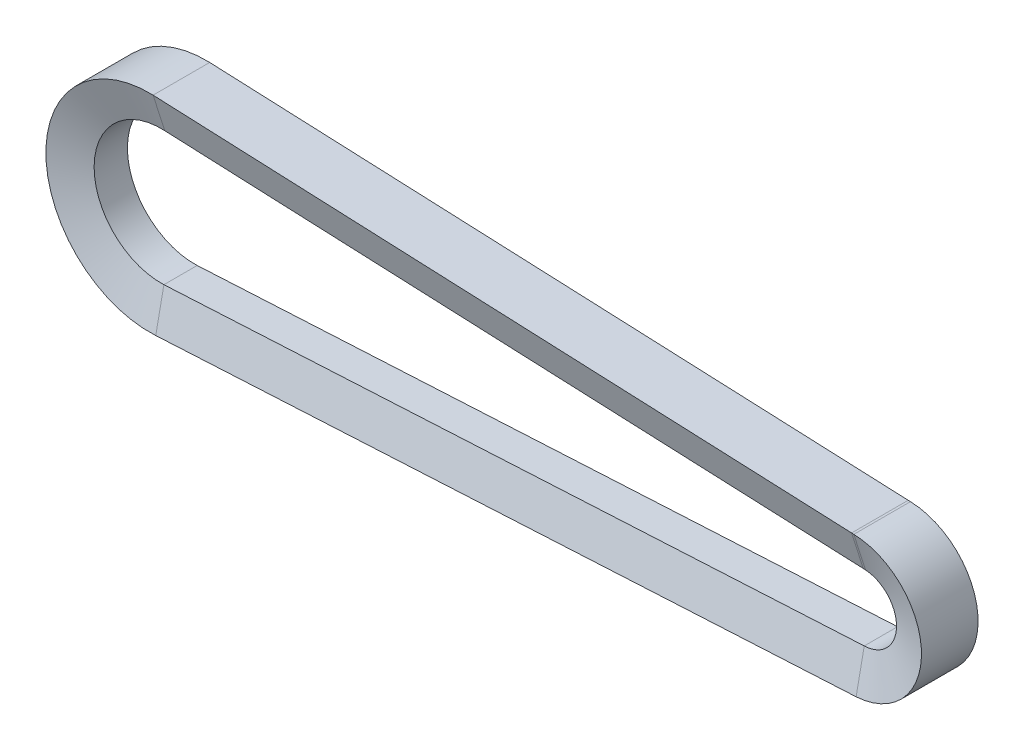
ISO-10303-21;
HEADER;
FILE_DESCRIPTION(('STEP AP214'),'2;1');
FILE_NAME('part.step','',(''),(''),'','','');
FILE_SCHEMA(('AUTOMOTIVE_DESIGN { 1 0 10303 214 1 1 1 1 }'));
ENDSEC;
DATA;
#1=APPLICATION_CONTEXT('core data for automotive mechanical design processes');
#2=APPLICATION_PROTOCOL_DEFINITION('international standard','automotive_design',2000,#1);
#3=PRODUCT_CONTEXT('',#1,'mechanical');
#4=PRODUCT('Part','Part','',(#3));
#5=PRODUCT_RELATED_PRODUCT_CATEGORY('part','',(#4));
#6=PRODUCT_DEFINITION_FORMATION('','',#4);
#7=PRODUCT_DEFINITION_CONTEXT('part definition',#1,'design');
#8=PRODUCT_DEFINITION('design','',#6,#7);
#9=PRODUCT_DEFINITION_SHAPE('','',#8);
#10=(LENGTH_UNIT() NAMED_UNIT(*) SI_UNIT(.MILLI.,.METRE.));
#11=(NAMED_UNIT(*) PLANE_ANGLE_UNIT() SI_UNIT($,.RADIAN.));
#12=(NAMED_UNIT(*) SI_UNIT($,.STERADIAN.) SOLID_ANGLE_UNIT());
#13=UNCERTAINTY_MEASURE_WITH_UNIT(LENGTH_MEASURE(1.E-05),#10,'distance_accuracy_value','');
#14=(GEOMETRIC_REPRESENTATION_CONTEXT(3) GLOBAL_UNCERTAINTY_ASSIGNED_CONTEXT((#13)) GLOBAL_UNIT_ASSIGNED_CONTEXT((#10,
#11,#12)) REPRESENTATION_CONTEXT('',''));
#15=CARTESIAN_POINT('',(0.,0.,0.));
#16=DIRECTION('',(0.,0.,1.));
#17=DIRECTION('',(1.,0.,0.));
#18=AXIS2_PLACEMENT_3D('',#15,#16,#17);
#19=CARTESIAN_POINT('',(-209.801736466426,18.9806721710866,5.00000000000001));
#20=DIRECTION('',(-0.042766356051632,-0.999085100874828,0.));
#21=DIRECTION('',(0.999085100874828,-0.0427663560516321,0.));
#22=AXIS2_PLACEMENT_3D('',#19,#20,#21);
#23=PLANE('',#22);
#24=DIRECTION('',(0.999085100874828,-0.0427663560516321,0.));
#25=VECTOR('',#24,1.);
#26=CARTESIAN_POINT('',(-209.801736466426,18.9806721710866,5.00000000000001));
#27=LINE('',#26,#25);
#28=CARTESIAN_POINT('',(-209.801736466426,18.9806721710866,5.00000000000001));
#29=VERTEX_POINT('',#28);
#30=CARTESIAN_POINT('',(0.,10.,5.00000000000001));
#31=VERTEX_POINT('',#30);
#32=EDGE_CURVE('E11',#29,#31,#27,.T.);
#33=ORIENTED_EDGE('',*,*,#32,.F.);
#34=DIRECTION('',(0.,0.,-1.));
#35=VECTOR('',#34,1.);
#36=CARTESIAN_POINT('',(-209.801736466426,18.9806721710866,5.00000000000001));
#37=LINE('',#36,#35);
#38=CARTESIAN_POINT('',(-209.801736466426,18.9806721710866,-4.99999999999999));
#39=VERTEX_POINT('',#38);
#40=EDGE_CURVE('E36',#29,#39,#37,.T.);
#41=ORIENTED_EDGE('',*,*,#40,.T.);
#42=DIRECTION('',(0.999085100874828,-0.0427663560516321,0.));
#43=VECTOR('',#42,1.);
#44=CARTESIAN_POINT('',(-209.801736466426,18.9806721710866,-4.99999999999999));
#45=LINE('',#44,#43);
#46=CARTESIAN_POINT('',(0.,10.,-4.99999999999999));
#47=VERTEX_POINT('',#46);
#48=EDGE_CURVE('E130',#39,#47,#45,.T.);
#49=ORIENTED_EDGE('',*,*,#48,.T.);
#50=DIRECTION('',(0.,0.,-1.));
#51=VECTOR('',#50,1.);
#52=CARTESIAN_POINT('',(0.,10.,5.00000000000001));
#53=LINE('',#52,#51);
#54=EDGE_CURVE('E133',#31,#47,#53,.T.);
#55=ORIENTED_EDGE('',*,*,#54,.F.);
#56=EDGE_LOOP('',(#33,#41,#49,#55));
#57=FACE_BOUND('',#56,.T.);
#58=ADVANCED_FACE('F33',(#57),#23,.T.);
#59=CARTESIAN_POINT('',(-209.801736466426,29.9806721710866,8.50000000000001));
#60=DIRECTION('',(-0.012977696852829,-0.303178123328485,0.952845530460952));
#61=DIRECTION('',(0.,-0.952925780013262,-0.303203657276948));
#62=AXIS2_PLACEMENT_3D('',#59,#60,#61);
#63=PLANE('',#62);
#64=DIRECTION('',(0.999085100874828,-0.0427663560516321,0.));
#65=VECTOR('',#64,1.);
#66=CARTESIAN_POINT('',(-209.801736466426,29.9806721710866,8.50000000000001));
#67=LINE('',#66,#65);
#68=CARTESIAN_POINT('',(-209.801736466426,29.9806721710866,8.50000000000001));
#69=VERTEX_POINT('',#68);
#70=CARTESIAN_POINT('',(0.,21.,8.50000000000001));
#71=VERTEX_POINT('',#70);
#72=EDGE_CURVE('E41',#69,#71,#67,.T.);
#73=ORIENTED_EDGE('',*,*,#72,.F.);
#74=DIRECTION('',(0.,-0.952925780013262,-0.303203657276948));
#75=VECTOR('',#74,1.);
#76=CARTESIAN_POINT('',(-209.801736466426,29.9806721710866,8.50000000000001));
#77=LINE('',#76,#75);
#78=EDGE_CURVE('E216',#69,#29,#77,.T.);
#79=ORIENTED_EDGE('',*,*,#78,.T.);
#80=ORIENTED_EDGE('',*,*,#32,.T.);
#81=DIRECTION('',(0.,-0.952925780013262,-0.303203657276948));
#82=VECTOR('',#81,1.);
#83=CARTESIAN_POINT('',(0.,21.,8.50000000000001));
#84=LINE('',#83,#82);
#85=EDGE_CURVE('E158',#71,#31,#84,.T.);
#86=ORIENTED_EDGE('',*,*,#85,.F.);
#87=EDGE_LOOP('',(#73,#79,#80,#86));
#88=FACE_BOUND('',#87,.T.);
#89=ADVANCED_FACE('F275',(#88),#63,.T.);
#90=CARTESIAN_POINT('',(-209.801736466426,29.9806721710866,-8.49999999999999));
#91=DIRECTION('',(0.042766356051632,0.999085100874828,0.));
#92=DIRECTION('',(-0.999085100874828,0.0427663560516321,0.));
#93=AXIS2_PLACEMENT_3D('',#90,#91,#92);
#94=PLANE('',#93);
#95=DIRECTION('',(0.999085100874828,-0.0427663560516321,0.));
#96=VECTOR('',#95,1.);
#97=CARTESIAN_POINT('',(-209.801736466426,29.9806721710866,-8.49999999999999));
#98=LINE('',#97,#96);
#99=CARTESIAN_POINT('',(-209.801736466426,29.9806721710866,-8.49999999999999));
#100=VERTEX_POINT('',#99);
#101=CARTESIAN_POINT('',(0.,21.,-8.49999999999999));
#102=VERTEX_POINT('',#101);
#103=EDGE_CURVE('E139',#100,#102,#98,.T.);
#104=ORIENTED_EDGE('',*,*,#103,.F.);
#105=DIRECTION('',(0.,0.,1.));
#106=VECTOR('',#105,1.);
#107=CARTESIAN_POINT('',(-209.801736466426,29.9806721710866,-8.49999999999999));
#108=LINE('',#107,#106);
#109=EDGE_CURVE('E194',#100,#69,#108,.T.);
#110=ORIENTED_EDGE('',*,*,#109,.T.);
#111=ORIENTED_EDGE('',*,*,#72,.T.);
#112=DIRECTION('',(0.,0.,1.));
#113=VECTOR('',#112,1.);
#114=CARTESIAN_POINT('',(0.,21.,-8.49999999999999));
#115=LINE('',#114,#113);
#116=EDGE_CURVE('E163',#102,#71,#115,.T.);
#117=ORIENTED_EDGE('',*,*,#116,.F.);
#118=EDGE_LOOP('',(#104,#110,#111,#117));
#119=FACE_BOUND('',#118,.T.);
#120=ADVANCED_FACE('F279',(#119),#94,.T.);
#121=CARTESIAN_POINT('',(-210.897624340249,-1.10668961638345,0.));
#122=DIRECTION('',(0.,0.,-1.));
#123=DIRECTION('',(-1.,0.,0.));
#124=AXIS2_PLACEMENT_3D('',#121,#122,#123);
#125=CYLINDRICAL_SURFACE('',#124,20.1172332544191);
#126=ORIENTED_EDGE('',*,*,#40,.F.);
#127=CARTESIAN_POINT('',(-210.897624340249,-1.10668961638345,5.00000000000001));
#128=DIRECTION('',(0.,0.,-1.));
#129=DIRECTION('',(0.0415397372742037,-0.99913685260188,0.));
#130=AXIS2_PLACEMENT_3D('',#127,#128,#129);
#131=CIRCLE('',#130,20.1172332544191);
#132=CARTESIAN_POINT('',(-210.061959756176,-21.2065587332616,5.00000000000001));
#133=VERTEX_POINT('',#132);
#134=EDGE_CURVE('E49',#133,#29,#131,.T.);
#135=ORIENTED_EDGE('',*,*,#134,.F.);
#136=DIRECTION('',(0.,0.,-1.));
#137=VECTOR('',#136,1.);
#138=CARTESIAN_POINT('',(-210.061959756176,-21.2065587332616,5.00000000000001));
#139=LINE('',#138,#137);
#140=CARTESIAN_POINT('',(-210.061959756176,-21.2065587332616,-4.99999999999999));
#141=VERTEX_POINT('',#140);
#142=EDGE_CURVE('E198',#133,#141,#139,.T.);
#143=ORIENTED_EDGE('',*,*,#142,.T.);
#144=CARTESIAN_POINT('',(-210.897624340249,-1.10668961638345,-4.99999999999999));
#145=DIRECTION('',(0.,0.,-1.));
#146=DIRECTION('',(0.0415397372742037,-0.99913685260188,0.));
#147=AXIS2_PLACEMENT_3D('',#144,#145,#146);
#148=CIRCLE('',#147,20.1172332544191);
#149=EDGE_CURVE('E196',#141,#39,#148,.T.);
#150=ORIENTED_EDGE('',*,*,#149,.T.);
#151=EDGE_LOOP('',(#126,#135,#143,#150));
#152=FACE_BOUND('',#151,.T.);
#153=ADVANCED_FACE('F238',(#152),#125,.F.);
#154=CARTESIAN_POINT('',(-209.006992487754,-32.1558529599484,8.50000000000001));
#155=CARTESIAN_POINT('',(-227.895510674847,-33.3060042131658,8.50000000000001));
#156=CARTESIAN_POINT('',(-241.759734866235,-20.4264756977117,8.50000000000001));
#157=CARTESIAN_POINT('',(-242.001752102635,-1.50452033187443,8.50000000000001));
#158=CARTESIAN_POINT('',(-242.243769339035,17.4174350339629,8.50000000000001));
#159=CARTESIAN_POINT('',(-228.713492381198,30.6473470765156,8.50000000000001));
#160=CARTESIAN_POINT('',(-209.801736466426,29.9806721710866,8.50000000000001));
#161=CARTESIAN_POINT('',(-210.061959756176,-21.2065587332616,5.));
#162=CARTESIAN_POINT('',(-222.289559552389,-21.7149288146034,5.));
#163=CARTESIAN_POINT('',(-231.093679644159,-13.214334345647,5.));
#164=CARTESIAN_POINT('',(-231.014435858584,-0.976427770648103,5.));
#165=CARTESIAN_POINT('',(-230.93519207301,11.2614788043508,5.));
#166=CARTESIAN_POINT('',(-222.021727525605,19.6473470765156,5.));
#167=CARTESIAN_POINT('',(-209.801736466426,18.9806721710866,5.));
#168=(BOUNDED_SURFACE() B_SPLINE_SURFACE(1,3,((#154,#155,#156,#157,#158,#159,#160),(#161,#162,
#163,#164,#165,#166,#167)),.UNSPECIFIED.,.F.,.F.,.F.) B_SPLINE_SURFACE_WITH_KNOTS((2,2),(4,3,4),
(0.,1.),(0.,0.5,1.),
.UNSPECIFIED.) GEOMETRIC_REPRESENTATION_ITEM() RATIONAL_B_SPLINE_SURFACE(((1.,0.793282988873798,
0.793282988873798,1.,0.793282988873798,0.793282988873798,1.),(1.,0.793282988873798,
0.793282988873798,1.,0.793282988873798,0.793282988873798,1.))) REPRESENTATION_ITEM('') SURFACE());
#169=CARTESIAN_POINT('',(-210.897624340249,-1.10668961638345,8.50000000000001));
#170=DIRECTION('',(0.,0.,-1.));
#171=DIRECTION('',(0.0607789821440281,-0.998151248724128,0.));
#172=AXIS2_PLACEMENT_3D('',#169,#170,#171);
#173=CIRCLE('',#172,31.1066718428225);
#174=CARTESIAN_POINT('',(-209.006992487754,-32.1558529599484,8.50000000000001));
#175=VERTEX_POINT('',#174);
#176=EDGE_CURVE('E58',#175,#69,#173,.T.);
#177=DIRECTION('',(-0.0913914097409167,0.948533158323657,-0.303203657276948));
#178=VECTOR('',#177,1.);
#179=CARTESIAN_POINT('',(-209.006992487754,-32.1558529599484,8.50000000000001));
#180=LINE('',#179,#178);
#181=EDGE_CURVE('E213',#175,#133,#180,.T.);
#182=ORIENTED_EDGE('',*,*,#134,.T.);
#183=ORIENTED_EDGE('',*,*,#78,.F.);
#184=ORIENTED_EDGE('',*,*,#176,.F.);
#185=ORIENTED_EDGE('',*,*,#181,.T.);
#186=EDGE_LOOP('',(#182,#183,#184,#185));
#187=FACE_BOUND('',#186,.T.);
#188=ADVANCED_FACE('F264',(#187),#168,.T.);
#189=CARTESIAN_POINT('',(-210.897624340249,-1.10668961638345,0.));
#190=DIRECTION('',(0.,0.,-1.));
#191=DIRECTION('',(-1.,0.,0.));
#192=AXIS2_PLACEMENT_3D('',#189,#190,#191);
#193=CYLINDRICAL_SURFACE('',#192,31.1066718428225);
#194=ORIENTED_EDGE('',*,*,#176,.T.);
#195=ORIENTED_EDGE('',*,*,#109,.F.);
#196=CARTESIAN_POINT('',(-210.897624340249,-1.10668961638345,-8.49999999999999));
#197=DIRECTION('',(0.,0.,-1.));
#198=DIRECTION('',(0.0607789821440281,-0.998151248724128,0.));
#199=AXIS2_PLACEMENT_3D('',#196,#197,#198);
#200=CIRCLE('',#199,31.1066718428225);
#201=CARTESIAN_POINT('',(-209.006992487754,-32.1558529599484,-8.49999999999999));
#202=VERTEX_POINT('',#201);
#203=EDGE_CURVE('E91',#202,#100,#200,.T.);
#204=ORIENTED_EDGE('',*,*,#203,.F.);
#205=DIRECTION('',(0.,0.,1.));
#206=VECTOR('',#205,1.);
#207=CARTESIAN_POINT('',(-209.006992487754,-32.1558529599484,-8.49999999999999));
#208=LINE('',#207,#206);
#209=EDGE_CURVE('E188',#202,#175,#208,.T.);
#210=ORIENTED_EDGE('',*,*,#209,.T.);
#211=EDGE_LOOP('',(#194,#195,#204,#210));
#212=FACE_BOUND('',#211,.T.);
#213=ADVANCED_FACE('F261',(#212),#193,.T.);
#214=CARTESIAN_POINT('',(-210.061959756176,-21.2065587332616,-4.99999999999999));
#215=CARTESIAN_POINT('',(-222.289559552389,-21.7149288146034,-4.99999999999999));
#216=CARTESIAN_POINT('',(-231.093679644159,-13.214334345647,-4.99999999999999));
#217=CARTESIAN_POINT('',(-231.014435858584,-0.976427770648103,-4.99999999999999));
#218=CARTESIAN_POINT('',(-230.93519207301,11.2614788043508,-4.99999999999999));
#219=CARTESIAN_POINT('',(-222.021727525605,19.6473470765156,-4.99999999999999));
#220=CARTESIAN_POINT('',(-209.801736466426,18.9806721710866,-4.99999999999999));
#221=CARTESIAN_POINT('',(-209.006992487754,-32.1558529599484,-8.49999999999999));
#222=CARTESIAN_POINT('',(-227.895510674847,-33.3060042131658,-8.49999999999999));
#223=CARTESIAN_POINT('',(-241.759734866235,-20.4264756977117,-8.49999999999999));
#224=CARTESIAN_POINT('',(-242.001752102635,-1.50452033187443,-8.49999999999999));
#225=CARTESIAN_POINT('',(-242.243769339035,17.4174350339629,-8.49999999999999));
#226=CARTESIAN_POINT('',(-228.713492381198,30.6473470765156,-8.49999999999999));
#227=CARTESIAN_POINT('',(-209.801736466426,29.9806721710866,-8.49999999999999));
#228=(BOUNDED_SURFACE() B_SPLINE_SURFACE(1,3,((#214,#215,#216,#217,#218,#219,#220),(#221,#222,
#223,#224,#225,#226,#227)),.UNSPECIFIED.,.F.,.F.,.F.) B_SPLINE_SURFACE_WITH_KNOTS((2,2),(4,3,4),
(0.,1.),(0.,0.5,1.),
.UNSPECIFIED.) GEOMETRIC_REPRESENTATION_ITEM() RATIONAL_B_SPLINE_SURFACE(((1.,0.793282988873798,
0.793282988873798,1.,0.793282988873798,0.793282988873798,1.),(1.,0.793282988873798,
0.793282988873798,1.,0.793282988873798,0.793282988873798,1.))) REPRESENTATION_ITEM('') SURFACE());
#229=DIRECTION('',(0.,0.952925780013262,-0.303203657276946));
#230=VECTOR('',#229,1.);
#231=CARTESIAN_POINT('',(-209.801736466426,18.9806721710866,-4.99999999999999));
#232=LINE('',#231,#230);
#233=EDGE_CURVE('E192',#39,#100,#232,.T.);
#234=DIRECTION('',(0.0913914097409167,-0.948533158323657,-0.303203657276946));
#235=VECTOR('',#234,1.);
#236=CARTESIAN_POINT('',(-210.061959756176,-21.2065587332616,-4.99999999999999));
#237=LINE('',#236,#235);
#238=EDGE_CURVE('E183',#141,#202,#237,.T.);
#239=ORIENTED_EDGE('',*,*,#203,.T.);
#240=ORIENTED_EDGE('',*,*,#233,.F.);
#241=ORIENTED_EDGE('',*,*,#149,.F.);
#242=ORIENTED_EDGE('',*,*,#238,.T.);
#243=EDGE_LOOP('',(#239,#240,#241,#242));
#244=FACE_BOUND('',#243,.T.);
#245=ADVANCED_FACE('F263',(#244),#228,.T.);
#246=CARTESIAN_POINT('',(0.296516927087176,-9.98923388441293,5.00000000000001));
#247=DIRECTION('',(-0.0532491513071896,0.99858125752743,0.));
#248=DIRECTION('',(-0.99858125752743,-0.0532491513071896,0.));
#249=AXIS2_PLACEMENT_3D('',#246,#247,#248);
#250=PLANE('',#249);
#251=ORIENTED_EDGE('',*,*,#142,.F.);
#252=DIRECTION('',(-0.99858125752743,-0.0532491513071896,0.));
#253=VECTOR('',#252,1.);
#254=CARTESIAN_POINT('',(0.296516927087176,-9.98923388441293,5.00000000000001));
#255=LINE('',#254,#253);
#256=CARTESIAN_POINT('',(0.296516927087179,-9.98923388441292,5.00000000000001));
#257=VERTEX_POINT('',#256);
#258=EDGE_CURVE('E228',#257,#133,#255,.T.);
#259=ORIENTED_EDGE('',*,*,#258,.F.);
#260=DIRECTION('',(0.,0.,-1.));
#261=VECTOR('',#260,1.);
#262=CARTESIAN_POINT('',(0.296516927087177,-9.98923388441292,5.00000000000001));
#263=LINE('',#262,#261);
#264=CARTESIAN_POINT('',(0.296516927087179,-9.98923388441292,-4.99999999999999));
#265=VERTEX_POINT('',#264);
#266=EDGE_CURVE('E191',#257,#265,#263,.T.);
#267=ORIENTED_EDGE('',*,*,#266,.T.);
#268=DIRECTION('',(-0.99858125752743,-0.0532491513071896,0.));
#269=VECTOR('',#268,1.);
#270=CARTESIAN_POINT('',(0.296516927087176,-9.98923388441293,-4.99999999999999));
#271=LINE('',#270,#269);
#272=EDGE_CURVE('E186',#265,#141,#271,.T.);
#273=ORIENTED_EDGE('',*,*,#272,.T.);
#274=EDGE_LOOP('',(#251,#259,#267,#273));
#275=FACE_BOUND('',#274,.T.);
#276=ADVANCED_FACE('F243',(#275),#250,.T.);
#277=CARTESIAN_POINT('',(1.35148419550979,-20.9385281110997,8.50000000000001));
#278=DIRECTION('',(-0.016158761398816,0.303025229165234,0.952845530460952));
#279=DIRECTION('',(0.,-0.952969951464395,0.303064797701661));
#280=AXIS2_PLACEMENT_3D('',#277,#278,#279);
#281=PLANE('',#280);
#282=ORIENTED_EDGE('',*,*,#258,.T.);
#283=ORIENTED_EDGE('',*,*,#181,.F.);
#284=DIRECTION('',(-0.99858125752743,-0.0532491513071896,0.));
#285=VECTOR('',#284,1.);
#286=CARTESIAN_POINT('',(1.35148419550979,-20.9385281110997,8.50000000000001));
#287=LINE('',#286,#285);
#288=CARTESIAN_POINT('',(1.3514841955098,-20.9385281110997,8.50000000000001));
#289=VERTEX_POINT('',#288);
#290=EDGE_CURVE('E107',#289,#175,#287,.T.);
#291=ORIENTED_EDGE('',*,*,#290,.F.);
#292=DIRECTION('',(-0.0913914097409169,0.948533158323657,-0.303203657276948));
#293=VECTOR('',#292,1.);
#294=CARTESIAN_POINT('',(1.3514841955098,-20.9385281110997,8.50000000000001));
#295=LINE('',#294,#293);
#296=EDGE_CURVE('E210',#289,#257,#295,.T.);
#297=ORIENTED_EDGE('',*,*,#296,.T.);
#298=EDGE_LOOP('',(#282,#283,#291,#297));
#299=FACE_BOUND('',#298,.T.);
#300=ADVANCED_FACE('F295',(#299),#281,.T.);
#301=CARTESIAN_POINT('',(1.35148419550979,-20.9385281110997,-8.49999999999999));
#302=DIRECTION('',(0.0532491513071896,-0.99858125752743,0.));
#303=DIRECTION('',(0.99858125752743,0.0532491513071896,0.));
#304=AXIS2_PLACEMENT_3D('',#301,#302,#303);
#305=PLANE('',#304);
#306=ORIENTED_EDGE('',*,*,#290,.T.);
#307=ORIENTED_EDGE('',*,*,#209,.F.);
#308=DIRECTION('',(-0.99858125752743,-0.0532491513071896,0.));
#309=VECTOR('',#308,1.);
#310=CARTESIAN_POINT('',(1.35148419550979,-20.9385281110997,-8.49999999999999));
#311=LINE('',#310,#309);
#312=CARTESIAN_POINT('',(1.3514841955098,-20.9385281110997,-8.49999999999999));
#313=VERTEX_POINT('',#312);
#314=EDGE_CURVE('E113',#313,#202,#311,.T.);
#315=ORIENTED_EDGE('',*,*,#314,.F.);
#316=DIRECTION('',(0.,0.,1.));
#317=VECTOR('',#316,1.);
#318=CARTESIAN_POINT('',(1.3514841955098,-20.9385281110997,-8.49999999999999));
#319=LINE('',#318,#317);
#320=EDGE_CURVE('E179',#313,#289,#319,.T.);
#321=ORIENTED_EDGE('',*,*,#320,.T.);
#322=EDGE_LOOP('',(#306,#307,#315,#321));
#323=FACE_BOUND('',#322,.T.);
#324=ADVANCED_FACE('F260',(#323),#305,.T.);
#325=CARTESIAN_POINT('',(0.296516927087176,-9.98923388441293,-4.99999999999999));
#326=DIRECTION('',(-0.0161587613988159,0.303025229165233,-0.952845530460953));
#327=DIRECTION('',(0.,0.952969951464396,0.303064797701659));
#328=AXIS2_PLACEMENT_3D('',#325,#326,#327);
#329=PLANE('',#328);
#330=ORIENTED_EDGE('',*,*,#314,.T.);
#331=ORIENTED_EDGE('',*,*,#238,.F.);
#332=ORIENTED_EDGE('',*,*,#272,.F.);
#333=DIRECTION('',(0.0913914097409169,-0.948533158323657,-0.303203657276946));
#334=VECTOR('',#333,1.);
#335=CARTESIAN_POINT('',(0.296516927087177,-9.98923388441292,-4.99999999999999));
#336=LINE('',#335,#334);
#337=EDGE_CURVE('E172',#265,#313,#336,.T.);
#338=ORIENTED_EDGE('',*,*,#337,.T.);
#339=EDGE_LOOP('',(#330,#331,#332,#338));
#340=FACE_BOUND('',#339,.T.);
#341=ADVANCED_FACE('F241',(#340),#329,.T.);
#342=CARTESIAN_POINT('',(0.,0.,0.));
#343=DIRECTION('',(0.,0.,-1.));
#344=DIRECTION('',(-1.,0.,0.));
#345=AXIS2_PLACEMENT_3D('',#342,#343,#344);
#346=CYLINDRICAL_SURFACE('',#345,9.99363376783202);
#347=ORIENTED_EDGE('',*,*,#266,.F.);
#348=CARTESIAN_POINT('',(0.,0.,5.00000000000001));
#349=DIRECTION('',(0.,0.,-1.));
#350=DIRECTION('',(0.0663300791483875,0.997797735315213,0.));
#351=AXIS2_PLACEMENT_3D('',#348,#349,#350);
#352=CIRCLE('',#351,9.99363376783202);
#353=CARTESIAN_POINT('',(0.6628785188003,9.97162514111244,5.00000000000001));
#354=VERTEX_POINT('',#353);
#355=EDGE_CURVE('E224',#354,#257,#352,.T.);
#356=ORIENTED_EDGE('',*,*,#355,.F.);
#357=DIRECTION('',(0.,0.,-1.));
#358=VECTOR('',#357,1.);
#359=CARTESIAN_POINT('',(0.6628785188003,9.97162514111244,5.00000000000001));
#360=LINE('',#359,#358);
#361=CARTESIAN_POINT('',(0.6628785188003,9.97162514111244,-4.99999999999999));
#362=VERTEX_POINT('',#361);
#363=EDGE_CURVE('E182',#354,#362,#360,.T.);
#364=ORIENTED_EDGE('',*,*,#363,.T.);
#365=CARTESIAN_POINT('',(0.,0.,-4.99999999999999));
#366=DIRECTION('',(0.,0.,-1.));
#367=DIRECTION('',(0.0663300791483875,0.997797735315213,0.));
#368=AXIS2_PLACEMENT_3D('',#365,#366,#367);
#369=CIRCLE('',#368,9.99363376783202);
#370=EDGE_CURVE('E176',#362,#265,#369,.T.);
#371=ORIENTED_EDGE('',*,*,#370,.T.);
#372=EDGE_LOOP('',(#347,#356,#364,#371));
#373=FACE_BOUND('',#372,.T.);
#374=ADVANCED_FACE('F249',(#373),#346,.F.);
#375=CARTESIAN_POINT('',(0.662878518800297,20.9716251411124,8.50000000000001));
#376=CARTESIAN_POINT('',(38.8875532789714,19.7634061492055,8.50000000000001));
#377=CARTESIAN_POINT('',(39.5158334826072,-18.4751976124251,8.50000000000001));
#378=CARTESIAN_POINT('',(1.3514841955098,-20.9385281110997,8.50000000000001));
#379=CARTESIAN_POINT('',(0.662878518800297,9.97162514111244,5.));
#380=CARTESIAN_POINT('',(18.8380139832496,8.76340614920549,5.));
#381=CARTESIAN_POINT('',(18.5037475906957,-9.44877681336919,5.));
#382=CARTESIAN_POINT('',(0.296516927087177,-9.98923388441292,5.));
#383=(BOUNDED_SURFACE() B_SPLINE_SURFACE(1,3,((#375,#376,#377,#378),(#379,#380,#381,#382)),
.UNSPECIFIED.,.F.,.F.,.F.) B_SPLINE_SURFACE_WITH_KNOTS((2,2),(4,4),(0.,1.),(0.,1.),
.UNSPECIFIED.) GEOMETRIC_REPRESENTATION_ITEM() RATIONAL_B_SPLINE_SURFACE(((1.,0.365338943104627,
0.365338943104627,1.),(1.,0.365338943104627,0.365338943104627,1.))) REPRESENTATION_ITEM('') SURFACE());
#384=CARTESIAN_POINT('',(0.,0.,8.50000000000001));
#385=DIRECTION('',(0.,0.,-1.));
#386=DIRECTION('',(0.0315925745045354,0.999500830032759,0.));
#387=AXIS2_PLACEMENT_3D('',#384,#385,#386);
#388=CIRCLE('',#387,20.9820987746704);
#389=CARTESIAN_POINT('',(0.6628785188003,20.9716251411124,8.50000000000001));
#390=VERTEX_POINT('',#389);
#391=EDGE_CURVE('E207',#390,#289,#388,.T.);
#392=DIRECTION('',(0.,-0.952925780013262,-0.303203657276948));
#393=VECTOR('',#392,1.);
#394=CARTESIAN_POINT('',(0.6628785188003,20.9716251411124,8.50000000000001));
#395=LINE('',#394,#393);
#396=EDGE_CURVE('E205',#390,#354,#395,.T.);
#397=ORIENTED_EDGE('',*,*,#355,.T.);
#398=ORIENTED_EDGE('',*,*,#296,.F.);
#399=ORIENTED_EDGE('',*,*,#391,.F.);
#400=ORIENTED_EDGE('',*,*,#396,.T.);
#401=EDGE_LOOP('',(#397,#398,#399,#400));
#402=FACE_BOUND('',#401,.T.);
#403=ADVANCED_FACE('F256',(#402),#383,.T.);
#404=CARTESIAN_POINT('',(0.,0.,0.));
#405=DIRECTION('',(0.,0.,-1.));
#406=DIRECTION('',(-1.,0.,0.));
#407=AXIS2_PLACEMENT_3D('',#404,#405,#406);
#408=CYLINDRICAL_SURFACE('',#407,20.9820987746704);
#409=ORIENTED_EDGE('',*,*,#391,.T.);
#410=ORIENTED_EDGE('',*,*,#320,.F.);
#411=CARTESIAN_POINT('',(0.,0.,-8.49999999999999));
#412=DIRECTION('',(0.,0.,-1.));
#413=DIRECTION('',(0.0315925745045354,0.99950083003276,0.));
#414=AXIS2_PLACEMENT_3D('',#411,#412,#413);
#415=CIRCLE('',#414,20.9820987746704);
#416=CARTESIAN_POINT('',(0.6628785188003,20.9716251411124,-8.49999999999999));
#417=VERTEX_POINT('',#416);
#418=EDGE_CURVE('E175',#417,#313,#415,.T.);
#419=ORIENTED_EDGE('',*,*,#418,.F.);
#420=DIRECTION('',(0.,0.,1.));
#421=VECTOR('',#420,1.);
#422=CARTESIAN_POINT('',(0.6628785188003,20.9716251411124,-8.49999999999999));
#423=LINE('',#422,#421);
#424=EDGE_CURVE('E170',#417,#390,#423,.T.);
#425=ORIENTED_EDGE('',*,*,#424,.T.);
#426=EDGE_LOOP('',(#409,#410,#419,#425));
#427=FACE_BOUND('',#426,.T.);
#428=ADVANCED_FACE('F258',(#427),#408,.T.);
#429=CARTESIAN_POINT('',(0.662878518800297,9.97162514111244,-4.99999999999999));
#430=CARTESIAN_POINT('',(18.8380139832496,8.76340614920549,-4.99999999999999));
#431=CARTESIAN_POINT('',(18.5037475906957,-9.44877681336919,-4.99999999999999));
#432=CARTESIAN_POINT('',(0.296516927087177,-9.98923388441292,-4.99999999999999));
#433=CARTESIAN_POINT('',(0.662878518800297,20.9716251411124,-8.49999999999999));
#434=CARTESIAN_POINT('',(38.8875532789715,19.7634061492055,-8.49999999999999));
#435=CARTESIAN_POINT('',(39.5158334826072,-18.4751976124251,-8.49999999999999));
#436=CARTESIAN_POINT('',(1.3514841955098,-20.9385281110997,-8.49999999999999));
#437=(BOUNDED_SURFACE() B_SPLINE_SURFACE(1,3,((#429,#430,#431,#432),(#433,#434,#435,#436)),
.UNSPECIFIED.,.F.,.F.,.F.) B_SPLINE_SURFACE_WITH_KNOTS((2,2),(4,4),(0.,1.),(0.,1.),
.UNSPECIFIED.) GEOMETRIC_REPRESENTATION_ITEM() RATIONAL_B_SPLINE_SURFACE(((1.,0.365338943104627,
0.365338943104627,1.),(1.,0.365338943104627,0.365338943104627,1.))) REPRESENTATION_ITEM('') SURFACE());
#438=DIRECTION('',(0.,0.952925780013262,-0.303203657276946));
#439=VECTOR('',#438,1.);
#440=CARTESIAN_POINT('',(0.6628785188003,9.97162514111244,-4.99999999999999));
#441=LINE('',#440,#439);
#442=EDGE_CURVE('E150',#362,#417,#441,.T.);
#443=ORIENTED_EDGE('',*,*,#418,.T.);
#444=ORIENTED_EDGE('',*,*,#337,.F.);
#445=ORIENTED_EDGE('',*,*,#370,.F.);
#446=ORIENTED_EDGE('',*,*,#442,.T.);
#447=EDGE_LOOP('',(#443,#444,#445,#446));
#448=FACE_BOUND('',#447,.T.);
#449=ADVANCED_FACE('F248',(#448),#437,.T.);
#450=CARTESIAN_POINT('',(0.,10.,5.00000000000001));
#451=DIRECTION('',(-0.0427663560516321,-0.999085100874828,0.));
#452=DIRECTION('',(0.999085100874828,-0.0427663560516321,0.));
#453=AXIS2_PLACEMENT_3D('',#450,#451,#452);
#454=PLANE('',#453);
#455=ORIENTED_EDGE('',*,*,#363,.F.);
#456=DIRECTION('',(0.999085100874828,-0.0427663560516321,0.));
#457=VECTOR('',#456,1.);
#458=CARTESIAN_POINT('',(0.,10.,5.00000000000001));
#459=LINE('',#458,#457);
#460=EDGE_CURVE('E157',#31,#354,#459,.T.);
#461=ORIENTED_EDGE('',*,*,#460,.F.);
#462=ORIENTED_EDGE('',*,*,#54,.T.);
#463=DIRECTION('',(0.999085100874828,-0.0427663560516321,0.));
#464=VECTOR('',#463,1.);
#465=CARTESIAN_POINT('',(0.,10.,-4.99999999999999));
#466=LINE('',#465,#464);
#467=EDGE_CURVE('E145',#47,#362,#466,.T.);
#468=ORIENTED_EDGE('',*,*,#467,.T.);
#469=EDGE_LOOP('',(#455,#461,#462,#468));
#470=FACE_BOUND('',#469,.T.);
#471=ADVANCED_FACE('F155',(#470),#454,.T.);
#472=CARTESIAN_POINT('',(0.,21.,8.50000000000001));
#473=DIRECTION('',(-0.012977696852829,-0.303178123328485,0.952845530460952));
#474=DIRECTION('',(0.,-0.952925780013262,-0.303203657276948));
#475=AXIS2_PLACEMENT_3D('',#472,#473,#474);
#476=PLANE('',#475);
#477=ORIENTED_EDGE('',*,*,#460,.T.);
#478=ORIENTED_EDGE('',*,*,#396,.F.);
#479=DIRECTION('',(0.999085100874828,-0.0427663560516321,0.));
#480=VECTOR('',#479,1.);
#481=CARTESIAN_POINT('',(0.,21.,8.50000000000001));
#482=LINE('',#481,#480);
#483=EDGE_CURVE('E202',#71,#390,#482,.T.);
#484=ORIENTED_EDGE('',*,*,#483,.F.);
#485=ORIENTED_EDGE('',*,*,#85,.T.);
#486=EDGE_LOOP('',(#477,#478,#484,#485));
#487=FACE_BOUND('',#486,.T.);
#488=ADVANCED_FACE('F252',(#487),#476,.T.);
#489=CARTESIAN_POINT('',(0.,21.,-8.49999999999999));
#490=DIRECTION('',(0.0427663560516321,0.999085100874828,0.));
#491=DIRECTION('',(-0.999085100874828,0.0427663560516321,0.));
#492=AXIS2_PLACEMENT_3D('',#489,#490,#491);
#493=PLANE('',#492);
#494=ORIENTED_EDGE('',*,*,#483,.T.);
#495=ORIENTED_EDGE('',*,*,#424,.F.);
#496=DIRECTION('',(0.999085100874828,-0.0427663560516321,0.));
#497=VECTOR('',#496,1.);
#498=CARTESIAN_POINT('',(0.,21.,-8.49999999999999));
#499=LINE('',#498,#497);
#500=EDGE_CURVE('E169',#102,#417,#499,.T.);
#501=ORIENTED_EDGE('',*,*,#500,.F.);
#502=ORIENTED_EDGE('',*,*,#116,.T.);
#503=EDGE_LOOP('',(#494,#495,#501,#502));
#504=FACE_BOUND('',#503,.T.);
#505=ADVANCED_FACE('F388',(#504),#493,.T.);
#506=CARTESIAN_POINT('',(0.,10.,-4.99999999999999));
#507=DIRECTION('',(-0.012977696852829,-0.303178123328484,-0.952845530460953));
#508=DIRECTION('',(0.,0.952925780013262,-0.303203657276946));
#509=AXIS2_PLACEMENT_3D('',#506,#507,#508);
#510=PLANE('',#509);
#511=ORIENTED_EDGE('',*,*,#500,.T.);
#512=ORIENTED_EDGE('',*,*,#442,.F.);
#513=ORIENTED_EDGE('',*,*,#467,.F.);
#514=DIRECTION('',(0.,0.952925780013262,-0.303203657276946));
#515=VECTOR('',#514,1.);
#516=CARTESIAN_POINT('',(0.,10.,-4.99999999999999));
#517=LINE('',#516,#515);
#518=EDGE_CURVE('E148',#47,#102,#517,.T.);
#519=ORIENTED_EDGE('',*,*,#518,.T.);
#520=EDGE_LOOP('',(#511,#512,#513,#519));
#521=FACE_BOUND('',#520,.T.);
#522=ADVANCED_FACE('F147',(#521),#510,.T.);
#523=CARTESIAN_POINT('',(-209.801736466426,18.9806721710866,-4.99999999999999));
#524=DIRECTION('',(-0.012977696852829,-0.303178123328484,-0.952845530460953));
#525=DIRECTION('',(0.,0.952925780013262,-0.303203657276946));
#526=AXIS2_PLACEMENT_3D('',#523,#524,#525);
#527=PLANE('',#526);
#528=ORIENTED_EDGE('',*,*,#233,.T.);
#529=ORIENTED_EDGE('',*,*,#103,.T.);
#530=ORIENTED_EDGE('',*,*,#518,.F.);
#531=ORIENTED_EDGE('',*,*,#48,.F.);
#532=EDGE_LOOP('',(#528,#529,#530,#531));
#533=FACE_BOUND('',#532,.T.);
#534=ADVANCED_FACE('F160',(#533),#527,.T.);
#535=CLOSED_SHELL('',(#58,#89,#120,#153,#188,#213,#245,#276,#300,#324,#341,#374,#403,#428,#449,
#471,#488,#505,#522,#534));
#536=MANIFOLD_SOLID_BREP('B2',#535);
#537=ADVANCED_BREP_SHAPE_REPRESENTATION('',(#18,#536),#14);
#538=SHAPE_DEFINITION_REPRESENTATION(#9,#537);
ENDSEC;
END-ISO-10303-21;
